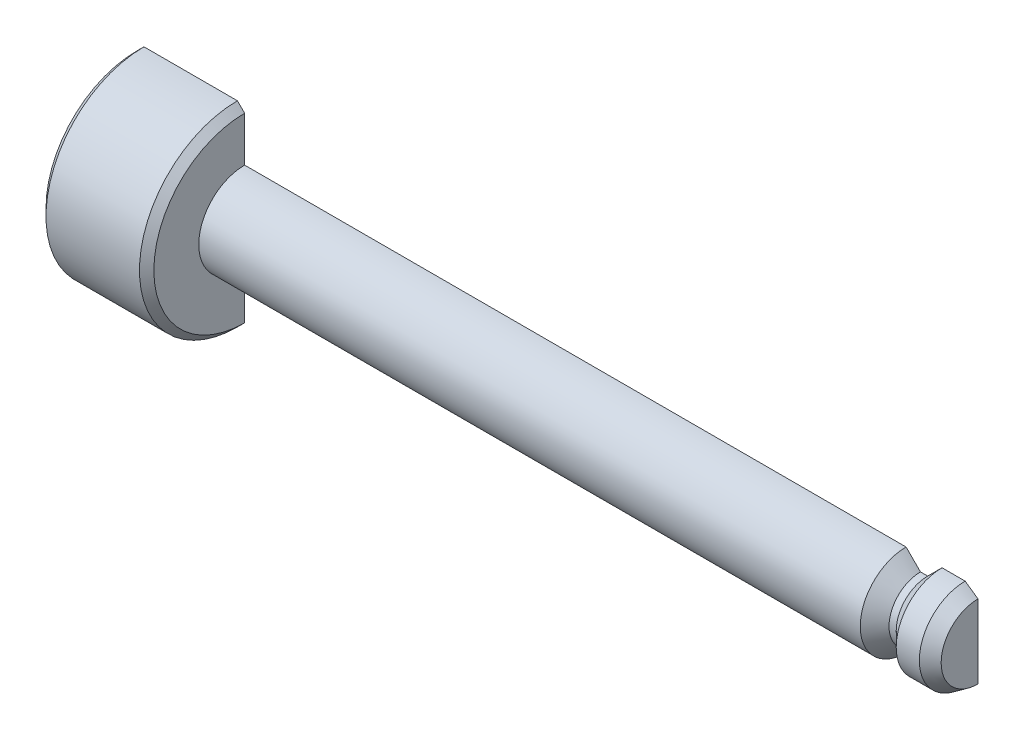
ISO-10303-21;
HEADER;
FILE_DESCRIPTION(('STEP AP214'),'2;1');
FILE_NAME('part.step','',(''),(''),'','','');
FILE_SCHEMA(('AUTOMOTIVE_DESIGN { 1 0 10303 214 1 1 1 1 }'));
ENDSEC;
DATA;
#1=APPLICATION_CONTEXT('core data for automotive mechanical design processes');
#2=APPLICATION_PROTOCOL_DEFINITION('international standard','automotive_design',2000,#1);
#3=PRODUCT_CONTEXT('',#1,'mechanical');
#4=PRODUCT('Part','Part','',(#3));
#5=PRODUCT_RELATED_PRODUCT_CATEGORY('part','',(#4));
#6=PRODUCT_DEFINITION_FORMATION('','',#4);
#7=PRODUCT_DEFINITION_CONTEXT('part definition',#1,'design');
#8=PRODUCT_DEFINITION('design','',#6,#7);
#9=PRODUCT_DEFINITION_SHAPE('','',#8);
#10=(LENGTH_UNIT() NAMED_UNIT(*) SI_UNIT(.MILLI.,.METRE.));
#11=(NAMED_UNIT(*) PLANE_ANGLE_UNIT() SI_UNIT($,.RADIAN.));
#12=(NAMED_UNIT(*) SI_UNIT($,.STERADIAN.) SOLID_ANGLE_UNIT());
#13=UNCERTAINTY_MEASURE_WITH_UNIT(LENGTH_MEASURE(1.E-05),#10,'distance_accuracy_value','');
#14=(GEOMETRIC_REPRESENTATION_CONTEXT(3) GLOBAL_UNCERTAINTY_ASSIGNED_CONTEXT((#13)) GLOBAL_UNIT_ASSIGNED_CONTEXT((#10,
#11,#12)) REPRESENTATION_CONTEXT('',''));
#15=CARTESIAN_POINT('',(0.,0.,0.));
#16=DIRECTION('',(0.,0.,1.));
#17=DIRECTION('',(1.,0.,0.));
#18=AXIS2_PLACEMENT_3D('',#15,#16,#17);
#19=CARTESIAN_POINT('',(20.4,0.,0.));
#20=DIRECTION('',(-1.,0.,0.));
#21=DIRECTION('',(0.,0.,1.));
#22=AXIS2_PLACEMENT_3D('',#19,#20,#21);
#23=CYLINDRICAL_SURFACE('',#22,1.275);
#24=CARTESIAN_POINT('',(18.4,0.,0.));
#25=DIRECTION('',(-1.,0.,0.));
#26=DIRECTION('',(0.,1.,0.));
#27=AXIS2_PLACEMENT_3D('',#24,#25,#26);
#28=CIRCLE('',#27,1.275);
#29=CARTESIAN_POINT('',(18.4,-1.275,0.));
#30=VERTEX_POINT('',#29);
#31=CARTESIAN_POINT('',(18.4,1.275,0.));
#32=VERTEX_POINT('',#31);
#33=EDGE_CURVE('E170',#30,#32,#28,.T.);
#34=ORIENTED_EDGE('',*,*,#33,.T.);
#35=DIRECTION('',(-1.,0.,0.));
#36=VECTOR('',#35,1.);
#37=CARTESIAN_POINT('',(20.4,1.275,0.));
#38=LINE('',#37,#36);
#39=CARTESIAN_POINT('',(0.,1.275,0.));
#40=VERTEX_POINT('',#39);
#41=EDGE_CURVE('E179',#32,#40,#38,.T.);
#42=ORIENTED_EDGE('',*,*,#41,.T.);
#43=CARTESIAN_POINT('',(0.,0.,0.));
#44=DIRECTION('',(1.,0.,0.));
#45=DIRECTION('',(0.,0.,-1.));
#46=AXIS2_PLACEMENT_3D('',#43,#44,#45);
#47=CIRCLE('',#46,1.275);
#48=CARTESIAN_POINT('',(0.,-1.275,0.));
#49=VERTEX_POINT('',#48);
#50=EDGE_CURVE('E156',#40,#49,#47,.T.);
#51=ORIENTED_EDGE('',*,*,#50,.T.);
#52=DIRECTION('',(-1.,0.,0.));
#53=VECTOR('',#52,1.);
#54=CARTESIAN_POINT('',(20.4,-1.275,0.));
#55=LINE('',#54,#53);
#56=EDGE_CURVE('E193',#49,#30,#55,.F.);
#57=ORIENTED_EDGE('',*,*,#56,.T.);
#58=EDGE_LOOP('',(#34,#42,#51,#57));
#59=FACE_BOUND('',#58,.T.);
#60=ADVANCED_FACE('F43',(#59),#23,.T.);
#61=CARTESIAN_POINT('',(-3.,0.,0.));
#62=DIRECTION('',(1.,0.,0.));
#63=DIRECTION('',(0.,0.,-1.));
#64=AXIS2_PLACEMENT_3D('',#61,#62,#63);
#65=CYLINDRICAL_SURFACE('',#64,2.725);
#66=DIRECTION('',(1.,0.,0.));
#67=VECTOR('',#66,1.);
#68=CARTESIAN_POINT('',(-3.,-2.725,0.));
#69=LINE('',#68,#67);
#70=CARTESIAN_POINT('',(-2.8,-2.725,0.));
#71=VERTEX_POINT('',#70);
#72=CARTESIAN_POINT('',(-0.200000000000001,-2.725,0.));
#73=VERTEX_POINT('',#72);
#74=EDGE_CURVE('E132',#71,#73,#69,.T.);
#75=ORIENTED_EDGE('',*,*,#74,.T.);
#76=CARTESIAN_POINT('',(-0.200000000000001,0.,0.));
#77=DIRECTION('',(1.,0.,0.));
#78=DIRECTION('',(0.,0.,-1.));
#79=AXIS2_PLACEMENT_3D('',#76,#77,#78);
#80=CIRCLE('',#79,2.725);
#81=CARTESIAN_POINT('',(-0.200000000000001,2.725,0.));
#82=VERTEX_POINT('',#81);
#83=EDGE_CURVE('E144',#73,#82,#80,.F.);
#84=ORIENTED_EDGE('',*,*,#83,.T.);
#85=DIRECTION('',(-1.,0.,0.));
#86=VECTOR('',#85,1.);
#87=CARTESIAN_POINT('',(-3.,2.725,0.));
#88=LINE('',#87,#86);
#89=CARTESIAN_POINT('',(-2.8,2.725,0.));
#90=VERTEX_POINT('',#89);
#91=EDGE_CURVE('E210',#82,#90,#88,.T.);
#92=ORIENTED_EDGE('',*,*,#91,.T.);
#93=CARTESIAN_POINT('',(-2.8,0.,0.));
#94=DIRECTION('',(1.,0.,0.));
#95=DIRECTION('',(0.,0.,-1.));
#96=AXIS2_PLACEMENT_3D('',#93,#94,#95);
#97=CIRCLE('',#96,2.725);
#98=EDGE_CURVE('E139',#90,#71,#97,.T.);
#99=ORIENTED_EDGE('',*,*,#98,.T.);
#100=EDGE_LOOP('',(#75,#84,#92,#99));
#101=FACE_BOUND('',#100,.T.);
#102=ADVANCED_FACE('F214',(#101),#65,.T.);
#103=CARTESIAN_POINT('',(-3.,0.,0.));
#104=DIRECTION('',(1.,0.,0.));
#105=DIRECTION('',(0.,0.,-1.));
#106=AXIS2_PLACEMENT_3D('',#103,#104,#105);
#107=PLANE('',#106);
#108=CARTESIAN_POINT('',(-3.,0.,0.));
#109=DIRECTION('',(1.,0.,0.));
#110=DIRECTION('',(0.,0.,-1.));
#111=AXIS2_PLACEMENT_3D('',#108,#109,#110);
#112=CIRCLE('',#111,2.525);
#113=CARTESIAN_POINT('',(-3.,-2.525,0.));
#114=VERTEX_POINT('',#113);
#115=CARTESIAN_POINT('',(-3.,2.525,0.));
#116=VERTEX_POINT('',#115);
#117=EDGE_CURVE('E137',#114,#116,#112,.F.);
#118=ORIENTED_EDGE('',*,*,#117,.T.);
#119=DIRECTION('',(0.,-1.,0.));
#120=VECTOR('',#119,1.);
#121=CARTESIAN_POINT('',(-3.,2.725,0.));
#122=LINE('',#121,#120);
#123=EDGE_CURVE('E124',#116,#114,#122,.T.);
#124=ORIENTED_EDGE('',*,*,#123,.T.);
#125=EDGE_LOOP('',(#118,#124));
#126=FACE_BOUND('',#125,.T.);
#127=ADVANCED_FACE('F145',(#126),#107,.F.);
#128=CARTESIAN_POINT('',(0.,0.,0.));
#129=DIRECTION('',(1.,0.,0.));
#130=DIRECTION('',(0.,0.,-1.));
#131=AXIS2_PLACEMENT_3D('',#128,#129,#130);
#132=PLANE('',#131);
#133=DIRECTION('',(0.,-1.,0.));
#134=VECTOR('',#133,1.);
#135=CARTESIAN_POINT('',(0.,0.,0.));
#136=LINE('',#135,#134);
#137=CARTESIAN_POINT('',(0.,2.525,0.));
#138=VERTEX_POINT('',#137);
#139=EDGE_CURVE('E173',#138,#40,#136,.T.);
#140=ORIENTED_EDGE('',*,*,#139,.F.);
#141=CARTESIAN_POINT('',(0.,0.,0.));
#142=DIRECTION('',(1.,0.,0.));
#143=DIRECTION('',(0.,0.,-1.));
#144=AXIS2_PLACEMENT_3D('',#141,#142,#143);
#145=CIRCLE('',#144,2.525);
#146=CARTESIAN_POINT('',(0.,-2.525,0.));
#147=VERTEX_POINT('',#146);
#148=EDGE_CURVE('E148',#138,#147,#145,.T.);
#149=ORIENTED_EDGE('',*,*,#148,.T.);
#150=EDGE_CURVE('E191',#49,#147,#136,.T.);
#151=ORIENTED_EDGE('',*,*,#150,.F.);
#152=ORIENTED_EDGE('',*,*,#50,.F.);
#153=EDGE_LOOP('',(#140,#149,#151,#152));
#154=FACE_BOUND('',#153,.T.);
#155=ADVANCED_FACE('F225',(#154),#132,.T.);
#156=CARTESIAN_POINT('',(0.,0.,0.));
#157=DIRECTION('',(-1.,0.,0.));
#158=DIRECTION('',(0.,0.,1.));
#159=AXIS2_PLACEMENT_3D('',#156,#157,#158);
#160=CONICAL_SURFACE('',#159,2.525,0.785398163397446);
#161=DIRECTION('',(-0.707106781186549,0.707106781186546,0.));
#162=VECTOR('',#161,1.);
#163=CARTESIAN_POINT('',(2.52500000000001,0.,0.));
#164=LINE('',#163,#162);
#165=EDGE_CURVE('E66',#82,#138,#164,.F.);
#166=ORIENTED_EDGE('',*,*,#165,.F.);
#167=ORIENTED_EDGE('',*,*,#83,.F.);
#168=DIRECTION('',(0.707106781186549,0.707106781186546,0.));
#169=VECTOR('',#168,1.);
#170=CARTESIAN_POINT('',(2.52500000000001,0.,0.));
#171=LINE('',#170,#169);
#172=EDGE_CURVE('E187',#147,#73,#171,.F.);
#173=ORIENTED_EDGE('',*,*,#172,.F.);
#174=ORIENTED_EDGE('',*,*,#148,.F.);
#175=EDGE_LOOP('',(#166,#167,#173,#174));
#176=FACE_BOUND('',#175,.T.);
#177=ADVANCED_FACE('F218',(#176),#160,.T.);
#178=CARTESIAN_POINT('',(-2.8,0.,0.));
#179=DIRECTION('',(1.,0.,0.));
#180=DIRECTION('',(0.,0.,-1.));
#181=AXIS2_PLACEMENT_3D('',#178,#179,#180);
#182=CONICAL_SURFACE('',#181,2.725,0.785398163397449);
#183=DIRECTION('',(0.707106781186547,-0.707106781186548,0.));
#184=VECTOR('',#183,1.);
#185=CARTESIAN_POINT('',(-5.52499999999999,0.,0.));
#186=LINE('',#185,#184);
#187=EDGE_CURVE('E129',#71,#114,#186,.F.);
#188=ORIENTED_EDGE('',*,*,#187,.F.);
#189=ORIENTED_EDGE('',*,*,#98,.F.);
#190=DIRECTION('',(-0.707106781186547,-0.707106781186548,0.));
#191=VECTOR('',#190,1.);
#192=CARTESIAN_POINT('',(-5.52499999999999,0.,0.));
#193=LINE('',#192,#191);
#194=EDGE_CURVE('E130',#116,#90,#193,.F.);
#195=ORIENTED_EDGE('',*,*,#194,.F.);
#196=ORIENTED_EDGE('',*,*,#117,.F.);
#197=EDGE_LOOP('',(#188,#189,#195,#196));
#198=FACE_BOUND('',#197,.T.);
#199=ADVANCED_FACE('F46',(#198),#182,.T.);
#200=CARTESIAN_POINT('',(0.,0.,0.));
#201=DIRECTION('',(-1.,0.,0.));
#202=DIRECTION('',(0.,1.,0.));
#203=AXIS2_PLACEMENT_3D('',#200,#201,#202);
#204=CYLINDRICAL_SURFACE('',#203,0.875000000000012);
#205=CARTESIAN_POINT('',(19.,0.,0.));
#206=DIRECTION('',(-1.,0.,0.));
#207=DIRECTION('',(0.,1.,0.));
#208=AXIS2_PLACEMENT_3D('',#205,#206,#207);
#209=CIRCLE('',#208,0.875000000000012);
#210=CARTESIAN_POINT('',(19.,-0.875000000000011,0.));
#211=VERTEX_POINT('',#210);
#212=CARTESIAN_POINT('',(19.,0.875000000000007,0.));
#213=VERTEX_POINT('',#212);
#214=EDGE_CURVE('E164',#211,#213,#209,.T.);
#215=ORIENTED_EDGE('',*,*,#214,.T.);
#216=DIRECTION('',(-1.,0.,0.));
#217=VECTOR('',#216,1.);
#218=CARTESIAN_POINT('',(0.,0.875000000000012,0.));
#219=LINE('',#218,#217);
#220=CARTESIAN_POINT('',(18.8,0.87500000000001,0.));
#221=VERTEX_POINT('',#220);
#222=EDGE_CURVE('E185',#213,#221,#219,.T.);
#223=ORIENTED_EDGE('',*,*,#222,.T.);
#224=CARTESIAN_POINT('',(18.8,0.,0.));
#225=DIRECTION('',(-1.,0.,0.));
#226=DIRECTION('',(0.,1.,0.));
#227=AXIS2_PLACEMENT_3D('',#224,#225,#226);
#228=CIRCLE('',#227,0.875000000000012);
#229=CARTESIAN_POINT('',(18.8,-0.875000000000014,0.));
#230=VERTEX_POINT('',#229);
#231=EDGE_CURVE('E168',#230,#221,#228,.T.);
#232=ORIENTED_EDGE('',*,*,#231,.F.);
#233=DIRECTION('',(-1.,0.,0.));
#234=VECTOR('',#233,1.);
#235=CARTESIAN_POINT('',(0.,-0.875000000000012,0.));
#236=LINE('',#235,#234);
#237=EDGE_CURVE('E198',#230,#211,#236,.F.);
#238=ORIENTED_EDGE('',*,*,#237,.T.);
#239=EDGE_LOOP('',(#215,#223,#232,#238));
#240=FACE_BOUND('',#239,.T.);
#241=ADVANCED_FACE('F228',(#240),#204,.T.);
#242=CARTESIAN_POINT('',(19.4,0.,0.));
#243=DIRECTION('',(1.,0.,0.));
#244=DIRECTION('',(0.,-1.,0.));
#245=AXIS2_PLACEMENT_3D('',#242,#243,#244);
#246=CONICAL_SURFACE('',#245,1.275,0.785398163397448);
#247=ORIENTED_EDGE('',*,*,#214,.F.);
#248=DIRECTION('',(0.707106781186548,-0.707106781186547,0.));
#249=VECTOR('',#248,1.);
#250=CARTESIAN_POINT('',(18.125,0.,0.));
#251=LINE('',#250,#249);
#252=CARTESIAN_POINT('',(19.4,-1.275,0.));
#253=VERTEX_POINT('',#252);
#254=EDGE_CURVE('E201',#211,#253,#251,.T.);
#255=ORIENTED_EDGE('',*,*,#254,.T.);
#256=CARTESIAN_POINT('',(19.4,0.,0.));
#257=DIRECTION('',(-1.,0.,0.));
#258=DIRECTION('',(0.,1.,0.));
#259=AXIS2_PLACEMENT_3D('',#256,#257,#258);
#260=CIRCLE('',#259,1.275);
#261=CARTESIAN_POINT('',(19.4,1.275,0.));
#262=VERTEX_POINT('',#261);
#263=EDGE_CURVE('E163',#253,#262,#260,.T.);
#264=ORIENTED_EDGE('',*,*,#263,.T.);
#265=DIRECTION('',(-0.707106781186548,-0.707106781186547,0.));
#266=VECTOR('',#265,1.);
#267=CARTESIAN_POINT('',(18.125,0.,0.));
#268=LINE('',#267,#266);
#269=EDGE_CURVE('E184',#262,#213,#268,.T.);
#270=ORIENTED_EDGE('',*,*,#269,.T.);
#271=EDGE_LOOP('',(#247,#255,#264,#270));
#272=FACE_BOUND('',#271,.T.);
#273=ADVANCED_FACE('F235',(#272),#246,.T.);
#274=CARTESIAN_POINT('',(18.8,0.,0.));
#275=DIRECTION('',(-1.,0.,0.));
#276=DIRECTION('',(0.,1.,0.));
#277=AXIS2_PLACEMENT_3D('',#274,#275,#276);
#278=CONICAL_SURFACE('',#277,0.875000000000012,0.785398163397448);
#279=ORIENTED_EDGE('',*,*,#231,.T.);
#280=DIRECTION('',(-0.707106781186548,0.707106781186547,0.));
#281=VECTOR('',#280,1.);
#282=CARTESIAN_POINT('',(19.675,0.,0.));
#283=LINE('',#282,#281);
#284=EDGE_CURVE('E178',#221,#32,#283,.T.);
#285=ORIENTED_EDGE('',*,*,#284,.T.);
#286=ORIENTED_EDGE('',*,*,#33,.F.);
#287=DIRECTION('',(0.707106781186548,0.707106781186547,0.));
#288=VECTOR('',#287,1.);
#289=CARTESIAN_POINT('',(19.675,0.,0.));
#290=LINE('',#289,#288);
#291=EDGE_CURVE('E200',#30,#230,#290,.T.);
#292=ORIENTED_EDGE('',*,*,#291,.T.);
#293=EDGE_LOOP('',(#279,#285,#286,#292));
#294=FACE_BOUND('',#293,.T.);
#295=ADVANCED_FACE('F230',(#294),#278,.T.);
#296=CARTESIAN_POINT('',(20.4,0.,0.));
#297=DIRECTION('',(1.,0.,0.));
#298=DIRECTION('',(0.,0.,-1.));
#299=AXIS2_PLACEMENT_3D('',#296,#297,#298);
#300=PLANE('',#299);
#301=DIRECTION('',(0.,1.,0.));
#302=VECTOR('',#301,1.);
#303=CARTESIAN_POINT('',(20.4,2.725,0.));
#304=LINE('',#303,#302);
#305=CARTESIAN_POINT('',(20.4,-1.025,0.));
#306=VERTEX_POINT('',#305);
#307=CARTESIAN_POINT('',(20.4,1.025,0.));
#308=VERTEX_POINT('',#307);
#309=EDGE_CURVE('E209',#306,#308,#304,.T.);
#310=ORIENTED_EDGE('',*,*,#309,.T.);
#311=CARTESIAN_POINT('',(20.4,0.,0.));
#312=DIRECTION('',(1.,0.,0.));
#313=DIRECTION('',(0.,0.,-1.));
#314=AXIS2_PLACEMENT_3D('',#311,#312,#313);
#315=CIRCLE('',#314,1.025);
#316=EDGE_CURVE('E154',#308,#306,#315,.T.);
#317=ORIENTED_EDGE('',*,*,#316,.T.);
#318=EDGE_LOOP('',(#310,#317));
#319=FACE_BOUND('',#318,.T.);
#320=ADVANCED_FACE('F241',(#319),#300,.T.);
#321=CARTESIAN_POINT('',(20.4,0.,0.));
#322=DIRECTION('',(-1.,0.,0.));
#323=DIRECTION('',(0.,0.,1.));
#324=AXIS2_PLACEMENT_3D('',#321,#322,#323);
#325=CONICAL_SURFACE('',#324,1.025,0.61086523819801);
#326=DIRECTION('',(-0.819152044288995,0.573576436351042,0.));
#327=VECTOR('',#326,1.);
#328=CARTESIAN_POINT('',(21.8638517069107,0.,0.));
#329=LINE('',#328,#327);
#330=CARTESIAN_POINT('',(20.0429629983145,1.275,0.));
#331=VERTEX_POINT('',#330);
#332=EDGE_CURVE('E186',#331,#308,#329,.F.);
#333=ORIENTED_EDGE('',*,*,#332,.F.);
#334=CARTESIAN_POINT('',(20.0429629983145,0.,0.));
#335=DIRECTION('',(1.,0.,0.));
#336=DIRECTION('',(0.,0.,-1.));
#337=AXIS2_PLACEMENT_3D('',#334,#335,#336);
#338=CIRCLE('',#337,1.275);
#339=CARTESIAN_POINT('',(20.0429629983145,-1.275,0.));
#340=VERTEX_POINT('',#339);
#341=EDGE_CURVE('E155',#340,#331,#338,.F.);
#342=ORIENTED_EDGE('',*,*,#341,.F.);
#343=DIRECTION('',(0.819152044288995,0.573576436351042,0.));
#344=VECTOR('',#343,1.);
#345=CARTESIAN_POINT('',(21.8638517069107,0.,0.));
#346=LINE('',#345,#344);
#347=EDGE_CURVE('E56',#306,#340,#346,.F.);
#348=ORIENTED_EDGE('',*,*,#347,.F.);
#349=ORIENTED_EDGE('',*,*,#316,.F.);
#350=EDGE_LOOP('',(#333,#342,#348,#349));
#351=FACE_BOUND('',#350,.T.);
#352=ADVANCED_FACE('F239',(#351),#325,.T.);
#353=ORIENTED_EDGE('',*,*,#341,.T.);
#354=DIRECTION('',(-1.,0.,0.));
#355=VECTOR('',#354,1.);
#356=CARTESIAN_POINT('',(20.4,1.275,0.));
#357=LINE('',#356,#355);
#358=EDGE_CURVE('E11',#331,#262,#357,.T.);
#359=ORIENTED_EDGE('',*,*,#358,.T.);
#360=ORIENTED_EDGE('',*,*,#263,.F.);
#361=DIRECTION('',(-1.,0.,0.));
#362=VECTOR('',#361,1.);
#363=CARTESIAN_POINT('',(20.4,-1.275,0.));
#364=LINE('',#363,#362);
#365=EDGE_CURVE('E55',#253,#340,#364,.F.);
#366=ORIENTED_EDGE('',*,*,#365,.T.);
#367=EDGE_LOOP('',(#353,#359,#360,#366));
#368=FACE_BOUND('',#367,.T.);
#369=ADVANCED_FACE('F240',(#368),#23,.T.);
#370=CARTESIAN_POINT('',(0.,0.,0.));
#371=DIRECTION('',(0.,0.,1.));
#372=DIRECTION('',(1.,0.,0.));
#373=AXIS2_PLACEMENT_3D('',#370,#371,#372);
#374=PLANE('',#373);
#375=ORIENTED_EDGE('',*,*,#187,.T.);
#376=ORIENTED_EDGE('',*,*,#123,.F.);
#377=ORIENTED_EDGE('',*,*,#194,.T.);
#378=ORIENTED_EDGE('',*,*,#91,.F.);
#379=ORIENTED_EDGE('',*,*,#165,.T.);
#380=ORIENTED_EDGE('',*,*,#139,.T.);
#381=ORIENTED_EDGE('',*,*,#41,.F.);
#382=ORIENTED_EDGE('',*,*,#284,.F.);
#383=ORIENTED_EDGE('',*,*,#222,.F.);
#384=ORIENTED_EDGE('',*,*,#269,.F.);
#385=ORIENTED_EDGE('',*,*,#358,.F.);
#386=ORIENTED_EDGE('',*,*,#332,.T.);
#387=ORIENTED_EDGE('',*,*,#309,.F.);
#388=ORIENTED_EDGE('',*,*,#347,.T.);
#389=ORIENTED_EDGE('',*,*,#365,.F.);
#390=ORIENTED_EDGE('',*,*,#254,.F.);
#391=ORIENTED_EDGE('',*,*,#237,.F.);
#392=ORIENTED_EDGE('',*,*,#291,.F.);
#393=ORIENTED_EDGE('',*,*,#56,.F.);
#394=ORIENTED_EDGE('',*,*,#150,.T.);
#395=ORIENTED_EDGE('',*,*,#172,.T.);
#396=ORIENTED_EDGE('',*,*,#74,.F.);
#397=EDGE_LOOP('',(#375,#376,#377,#378,#379,#380,#381,#382,#383,#384,#385,#386,#387,#388,#389,
#390,#391,#392,#393,#394,#395,#396));
#398=FACE_BOUND('',#397,.T.);
#399=ADVANCED_FACE('F126',(#398),#374,.F.);
#400=CLOSED_SHELL('',(#60,#102,#127,#155,#177,#199,#241,#273,#295,#320,#352,#369,#399));
#401=MANIFOLD_SOLID_BREP('B2',#400);
#402=ADVANCED_BREP_SHAPE_REPRESENTATION('',(#18,#401),#14);
#403=SHAPE_DEFINITION_REPRESENTATION(#9,#402);
ENDSEC;
END-ISO-10303-21;
